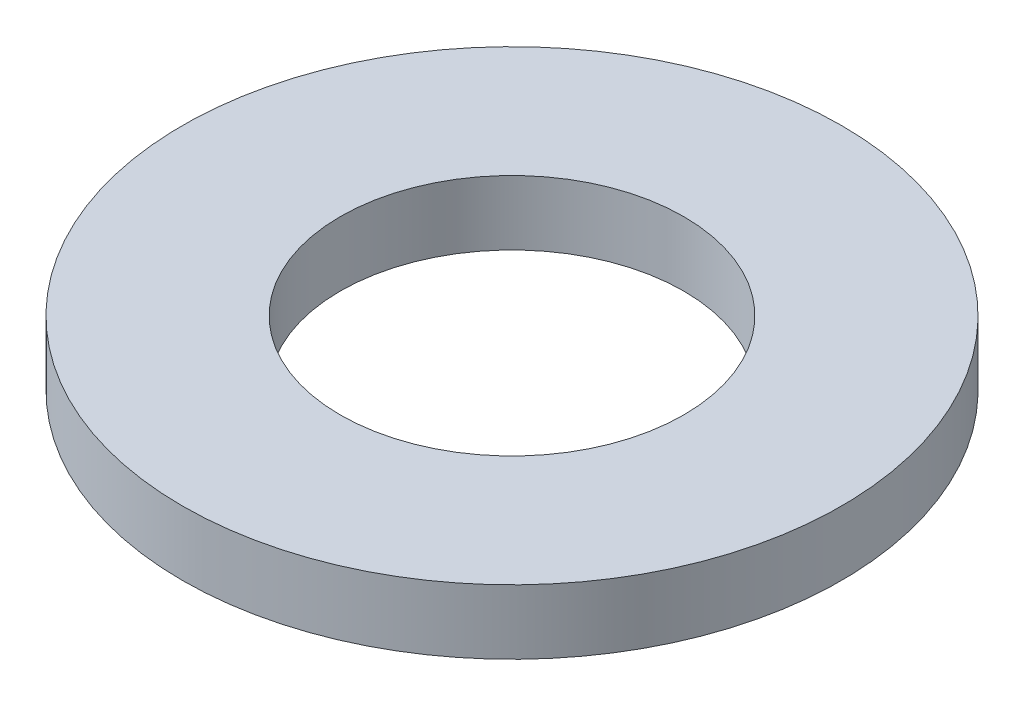
ISO-10303-21;
HEADER;
FILE_DESCRIPTION(('STEP AP214'),'2;1');
FILE_NAME('part.step','',(''),(''),'','','');
FILE_SCHEMA(('AUTOMOTIVE_DESIGN { 1 0 10303 214 1 1 1 1 }'));
ENDSEC;
DATA;
#1=APPLICATION_CONTEXT('core data for automotive mechanical design processes');
#2=APPLICATION_PROTOCOL_DEFINITION('international standard','automotive_design',2000,#1);
#3=PRODUCT_CONTEXT('',#1,'mechanical');
#4=PRODUCT('Part','Part','',(#3));
#5=PRODUCT_RELATED_PRODUCT_CATEGORY('part','',(#4));
#6=PRODUCT_DEFINITION_FORMATION('','',#4);
#7=PRODUCT_DEFINITION_CONTEXT('part definition',#1,'design');
#8=PRODUCT_DEFINITION('design','',#6,#7);
#9=PRODUCT_DEFINITION_SHAPE('','',#8);
#10=(LENGTH_UNIT() NAMED_UNIT(*) SI_UNIT(.MILLI.,.METRE.));
#11=(NAMED_UNIT(*) PLANE_ANGLE_UNIT() SI_UNIT($,.RADIAN.));
#12=(NAMED_UNIT(*) SI_UNIT($,.STERADIAN.) SOLID_ANGLE_UNIT());
#13=UNCERTAINTY_MEASURE_WITH_UNIT(LENGTH_MEASURE(1.E-05),#10,'distance_accuracy_value','');
#14=(GEOMETRIC_REPRESENTATION_CONTEXT(3) GLOBAL_UNCERTAINTY_ASSIGNED_CONTEXT((#13)) GLOBAL_UNIT_ASSIGNED_CONTEXT((#10,
#11,#12)) REPRESENTATION_CONTEXT('',''));
#15=CARTESIAN_POINT('',(0.,0.,0.));
#16=DIRECTION('',(0.,0.,1.));
#17=DIRECTION('',(1.,0.,0.));
#18=AXIS2_PLACEMENT_3D('',#15,#16,#17);
#19=CARTESIAN_POINT('',(19.4581662606197,12.3,-21.058476323617));
#20=DIRECTION('',(0.,1.,0.));
#21=DIRECTION('',(0.,0.,1.));
#22=AXIS2_PLACEMENT_3D('',#19,#20,#21);
#23=PLANE('',#22);
#24=CARTESIAN_POINT('',(19.4581662606197,12.3,-21.058476323617));
#25=DIRECTION('',(0.,1.,0.));
#26=DIRECTION('',(0.,0.,1.));
#27=AXIS2_PLACEMENT_3D('',#24,#25,#26);
#28=CIRCLE('',#27,62.8330061942196);
#29=CARTESIAN_POINT('',(19.4581662606197,12.3,41.7745298706026));
#30=VERTEX_POINT('',#29);
#31=EDGE_CURVE('E12',#30,#30,#28,.T.);
#32=ORIENTED_EDGE('',*,*,#31,.T.);
#33=EDGE_LOOP('',(#32));
#34=FACE_BOUND('',#33,.T.);
#35=CARTESIAN_POINT('',(19.4581662606197,12.3,-21.058476323617));
#36=DIRECTION('',(0.,1.,0.));
#37=DIRECTION('',(0.,0.,1.));
#38=AXIS2_PLACEMENT_3D('',#35,#36,#37);
#39=CIRCLE('',#38,32.75);
#40=CARTESIAN_POINT('',(19.4581662606197,12.3,11.691523676383));
#41=VERTEX_POINT('',#40);
#42=EDGE_CURVE('E54',#41,#41,#39,.T.);
#43=ORIENTED_EDGE('',*,*,#42,.F.);
#44=EDGE_LOOP('',(#43));
#45=FACE_BOUND('',#44,.T.);
#46=ADVANCED_FACE('F43',(#34,#45),#23,.T.);
#47=CARTESIAN_POINT('',(19.4581662606197,0.,-21.058476323617));
#48=DIRECTION('',(0.,1.,0.));
#49=DIRECTION('',(0.,0.,1.));
#50=AXIS2_PLACEMENT_3D('',#47,#48,#49);
#51=PLANE('',#50);
#52=CARTESIAN_POINT('',(19.4581662606197,0.,-21.058476323617));
#53=DIRECTION('',(0.,1.,0.));
#54=DIRECTION('',(0.,0.,1.));
#55=AXIS2_PLACEMENT_3D('',#52,#53,#54);
#56=CIRCLE('',#55,62.8330061942196);
#57=CARTESIAN_POINT('',(19.4581662606197,0.,41.7745298706026));
#58=VERTEX_POINT('',#57);
#59=EDGE_CURVE('E47',#58,#58,#56,.T.);
#60=ORIENTED_EDGE('',*,*,#59,.F.);
#61=EDGE_LOOP('',(#60));
#62=FACE_BOUND('',#61,.T.);
#63=CARTESIAN_POINT('',(19.4581662606197,0.,-21.058476323617));
#64=DIRECTION('',(0.,1.,0.));
#65=DIRECTION('',(0.,0.,1.));
#66=AXIS2_PLACEMENT_3D('',#63,#64,#65);
#67=CIRCLE('',#66,32.75);
#68=CARTESIAN_POINT('',(19.4581662606197,0.,11.691523676383));
#69=VERTEX_POINT('',#68);
#70=EDGE_CURVE('E56',#69,#69,#67,.T.);
#71=ORIENTED_EDGE('',*,*,#70,.T.);
#72=EDGE_LOOP('',(#71));
#73=FACE_BOUND('',#72,.T.);
#74=ADVANCED_FACE('F66',(#62,#73),#51,.F.);
#75=CARTESIAN_POINT('',(19.4581662606197,12.3,-21.058476323617));
#76=DIRECTION('',(0.,-1.,0.));
#77=DIRECTION('',(0.,0.,-1.));
#78=AXIS2_PLACEMENT_3D('',#75,#76,#77);
#79=CYLINDRICAL_SURFACE('',#78,62.8330061942196);
#80=ORIENTED_EDGE('',*,*,#31,.F.);
#81=EDGE_LOOP('',(#80));
#82=FACE_BOUND('',#81,.T.);
#83=ORIENTED_EDGE('',*,*,#59,.T.);
#84=EDGE_LOOP('',(#83));
#85=FACE_BOUND('',#84,.T.);
#86=ADVANCED_FACE('F45',(#82,#85),#79,.T.);
#87=CARTESIAN_POINT('',(19.4581662606197,12.3,-21.058476323617));
#88=DIRECTION('',(0.,-1.,0.));
#89=DIRECTION('',(0.,0.,-1.));
#90=AXIS2_PLACEMENT_3D('',#87,#88,#89);
#91=CYLINDRICAL_SURFACE('',#90,32.75);
#92=ORIENTED_EDGE('',*,*,#42,.T.);
#93=EDGE_LOOP('',(#92));
#94=FACE_BOUND('',#93,.T.);
#95=ORIENTED_EDGE('',*,*,#70,.F.);
#96=EDGE_LOOP('',(#95));
#97=FACE_BOUND('',#96,.T.);
#98=ADVANCED_FACE('F62',(#94,#97),#91,.F.);
#99=CLOSED_SHELL('',(#46,#74,#86,#98));
#100=MANIFOLD_SOLID_BREP('B2',#99);
#101=ADVANCED_BREP_SHAPE_REPRESENTATION('',(#18,#100),#14);
#102=SHAPE_DEFINITION_REPRESENTATION(#9,#101);
ENDSEC;
END-ISO-10303-21;
